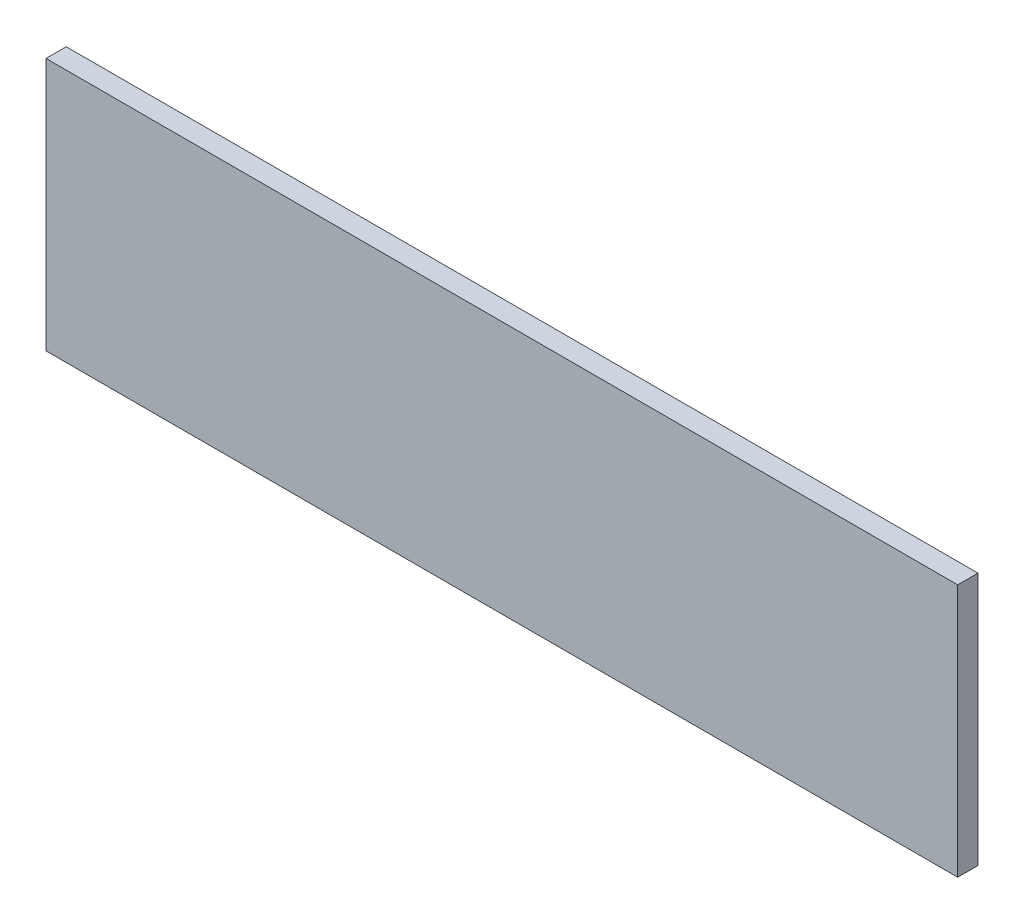
ISO-10303-21;
HEADER;
FILE_DESCRIPTION(('STEP AP214'),'2;1');
FILE_NAME('part.step','',(''),(''),'','','');
FILE_SCHEMA(('AUTOMOTIVE_DESIGN { 1 0 10303 214 1 1 1 1 }'));
ENDSEC;
DATA;
#1=APPLICATION_CONTEXT('core data for automotive mechanical design processes');
#2=APPLICATION_PROTOCOL_DEFINITION('international standard','automotive_design',2000,#1);
#3=PRODUCT_CONTEXT('',#1,'mechanical');
#4=PRODUCT('Part','Part','',(#3));
#5=PRODUCT_RELATED_PRODUCT_CATEGORY('part','',(#4));
#6=PRODUCT_DEFINITION_FORMATION('','',#4);
#7=PRODUCT_DEFINITION_CONTEXT('part definition',#1,'design');
#8=PRODUCT_DEFINITION('design','',#6,#7);
#9=PRODUCT_DEFINITION_SHAPE('','',#8);
#10=(LENGTH_UNIT() NAMED_UNIT(*) SI_UNIT(.MILLI.,.METRE.));
#11=(NAMED_UNIT(*) PLANE_ANGLE_UNIT() SI_UNIT($,.RADIAN.));
#12=(NAMED_UNIT(*) SI_UNIT($,.STERADIAN.) SOLID_ANGLE_UNIT());
#13=UNCERTAINTY_MEASURE_WITH_UNIT(LENGTH_MEASURE(1.E-05),#10,'distance_accuracy_value','');
#14=(GEOMETRIC_REPRESENTATION_CONTEXT(3) GLOBAL_UNCERTAINTY_ASSIGNED_CONTEXT((#13)) GLOBAL_UNIT_ASSIGNED_CONTEXT((#10,
#11,#12)) REPRESENTATION_CONTEXT('',''));
#15=CARTESIAN_POINT('',(0.,0.,0.));
#16=DIRECTION('',(0.,0.,1.));
#17=DIRECTION('',(1.,0.,0.));
#18=AXIS2_PLACEMENT_3D('',#15,#16,#17);
#19=CARTESIAN_POINT('',(-45.,-12.5,2.));
#20=DIRECTION('',(1.,0.,0.));
#21=DIRECTION('',(0.,0.,-1.));
#22=AXIS2_PLACEMENT_3D('',#19,#20,#21);
#23=PLANE('',#22);
#24=DIRECTION('',(0.,-1.,0.));
#25=VECTOR('',#24,1.);
#26=CARTESIAN_POINT('',(-45.,-12.5,0.));
#27=LINE('',#26,#25);
#28=CARTESIAN_POINT('',(-45.,12.5,0.));
#29=VERTEX_POINT('',#28);
#30=CARTESIAN_POINT('',(-45.,-12.5,0.));
#31=VERTEX_POINT('',#30);
#32=EDGE_CURVE('E110',#29,#31,#27,.T.);
#33=ORIENTED_EDGE('',*,*,#32,.T.);
#34=DIRECTION('',(0.,0.,-1.));
#35=VECTOR('',#34,1.);
#36=CARTESIAN_POINT('',(-45.,-12.5,2.));
#37=LINE('',#36,#35);
#38=CARTESIAN_POINT('',(-45.,-12.5,2.));
#39=VERTEX_POINT('',#38);
#40=EDGE_CURVE('E11',#39,#31,#37,.T.);
#41=ORIENTED_EDGE('',*,*,#40,.F.);
#42=DIRECTION('',(0.,-1.,0.));
#43=VECTOR('',#42,1.);
#44=CARTESIAN_POINT('',(-45.,-12.5,2.));
#45=LINE('',#44,#43);
#46=CARTESIAN_POINT('',(-45.,12.5,2.));
#47=VERTEX_POINT('',#46);
#48=EDGE_CURVE('E94',#47,#39,#45,.T.);
#49=ORIENTED_EDGE('',*,*,#48,.F.);
#50=DIRECTION('',(0.,0.,-1.));
#51=VECTOR('',#50,1.);
#52=CARTESIAN_POINT('',(-45.,12.5,2.));
#53=LINE('',#52,#51);
#54=EDGE_CURVE('E106',#47,#29,#53,.T.);
#55=ORIENTED_EDGE('',*,*,#54,.T.);
#56=EDGE_LOOP('',(#33,#41,#49,#55));
#57=FACE_BOUND('',#56,.T.);
#58=ADVANCED_FACE('F42',(#57),#23,.F.);
#59=CARTESIAN_POINT('',(45.,-12.5,2.));
#60=DIRECTION('',(0.,1.,0.));
#61=DIRECTION('',(-1.,0.,0.));
#62=AXIS2_PLACEMENT_3D('',#59,#60,#61);
#63=PLANE('',#62);
#64=DIRECTION('',(1.,0.,0.));
#65=VECTOR('',#64,1.);
#66=CARTESIAN_POINT('',(45.,-12.5,0.));
#67=LINE('',#66,#65);
#68=CARTESIAN_POINT('',(45.,-12.5,0.));
#69=VERTEX_POINT('',#68);
#70=EDGE_CURVE('E99',#31,#69,#67,.T.);
#71=ORIENTED_EDGE('',*,*,#70,.T.);
#72=DIRECTION('',(0.,0.,-1.));
#73=VECTOR('',#72,1.);
#74=CARTESIAN_POINT('',(45.,-12.5,2.));
#75=LINE('',#74,#73);
#76=CARTESIAN_POINT('',(45.,-12.5,2.));
#77=VERTEX_POINT('',#76);
#78=EDGE_CURVE('E51',#77,#69,#75,.T.);
#79=ORIENTED_EDGE('',*,*,#78,.F.);
#80=DIRECTION('',(1.,0.,0.));
#81=VECTOR('',#80,1.);
#82=CARTESIAN_POINT('',(45.,-12.5,2.));
#83=LINE('',#82,#81);
#84=EDGE_CURVE('E89',#39,#77,#83,.T.);
#85=ORIENTED_EDGE('',*,*,#84,.F.);
#86=ORIENTED_EDGE('',*,*,#40,.T.);
#87=EDGE_LOOP('',(#71,#79,#85,#86));
#88=FACE_BOUND('',#87,.T.);
#89=ADVANCED_FACE('F98',(#88),#63,.F.);
#90=CARTESIAN_POINT('',(45.,-12.5,2.));
#91=DIRECTION('',(-1.,0.,0.));
#92=DIRECTION('',(0.,0.,1.));
#93=AXIS2_PLACEMENT_3D('',#90,#91,#92);
#94=PLANE('',#93);
#95=DIRECTION('',(0.,1.,0.));
#96=VECTOR('',#95,1.);
#97=CARTESIAN_POINT('',(45.,-12.5,0.));
#98=LINE('',#97,#96);
#99=CARTESIAN_POINT('',(45.,12.5,0.));
#100=VERTEX_POINT('',#99);
#101=EDGE_CURVE('E76',#69,#100,#98,.T.);
#102=ORIENTED_EDGE('',*,*,#101,.T.);
#103=DIRECTION('',(0.,0.,-1.));
#104=VECTOR('',#103,1.);
#105=CARTESIAN_POINT('',(45.,12.5,2.));
#106=LINE('',#105,#104);
#107=CARTESIAN_POINT('',(45.,12.5,2.));
#108=VERTEX_POINT('',#107);
#109=EDGE_CURVE('E101',#108,#100,#106,.T.);
#110=ORIENTED_EDGE('',*,*,#109,.F.);
#111=DIRECTION('',(0.,1.,0.));
#112=VECTOR('',#111,1.);
#113=CARTESIAN_POINT('',(45.,-12.5,2.));
#114=LINE('',#113,#112);
#115=EDGE_CURVE('E92',#77,#108,#114,.T.);
#116=ORIENTED_EDGE('',*,*,#115,.F.);
#117=ORIENTED_EDGE('',*,*,#78,.T.);
#118=EDGE_LOOP('',(#102,#110,#116,#117));
#119=FACE_BOUND('',#118,.T.);
#120=ADVANCED_FACE('F102',(#119),#94,.F.);
#121=CARTESIAN_POINT('',(45.,12.5,2.));
#122=DIRECTION('',(0.,-1.,0.));
#123=DIRECTION('',(1.,0.,0.));
#124=AXIS2_PLACEMENT_3D('',#121,#122,#123);
#125=PLANE('',#124);
#126=DIRECTION('',(-1.,0.,0.));
#127=VECTOR('',#126,1.);
#128=CARTESIAN_POINT('',(45.,12.5,0.));
#129=LINE('',#128,#127);
#130=EDGE_CURVE('E82',#100,#29,#129,.T.);
#131=ORIENTED_EDGE('',*,*,#130,.T.);
#132=ORIENTED_EDGE('',*,*,#54,.F.);
#133=DIRECTION('',(-1.,0.,0.));
#134=VECTOR('',#133,1.);
#135=CARTESIAN_POINT('',(45.,12.5,2.));
#136=LINE('',#135,#134);
#137=EDGE_CURVE('E59',#108,#47,#136,.T.);
#138=ORIENTED_EDGE('',*,*,#137,.F.);
#139=ORIENTED_EDGE('',*,*,#109,.T.);
#140=EDGE_LOOP('',(#131,#132,#138,#139));
#141=FACE_BOUND('',#140,.T.);
#142=ADVANCED_FACE('F123',(#141),#125,.F.);
#143=CARTESIAN_POINT('',(0.,0.,2.));
#144=DIRECTION('',(0.,0.,1.));
#145=DIRECTION('',(1.,0.,0.));
#146=AXIS2_PLACEMENT_3D('',#143,#144,#145);
#147=PLANE('',#146);
#148=ORIENTED_EDGE('',*,*,#48,.T.);
#149=ORIENTED_EDGE('',*,*,#84,.T.);
#150=ORIENTED_EDGE('',*,*,#115,.T.);
#151=ORIENTED_EDGE('',*,*,#137,.T.);
#152=EDGE_LOOP('',(#148,#149,#150,#151));
#153=FACE_BOUND('',#152,.T.);
#154=ADVANCED_FACE('F90',(#153),#147,.T.);
#155=CARTESIAN_POINT('',(0.,0.,0.));
#156=DIRECTION('',(0.,0.,1.));
#157=DIRECTION('',(1.,0.,0.));
#158=AXIS2_PLACEMENT_3D('',#155,#156,#157);
#159=PLANE('',#158);
#160=ORIENTED_EDGE('',*,*,#32,.F.);
#161=ORIENTED_EDGE('',*,*,#130,.F.);
#162=ORIENTED_EDGE('',*,*,#101,.F.);
#163=ORIENTED_EDGE('',*,*,#70,.F.);
#164=EDGE_LOOP('',(#160,#161,#162,#163));
#165=FACE_BOUND('',#164,.T.);
#166=ADVANCED_FACE('F126',(#165),#159,.F.);
#167=CLOSED_SHELL('',(#58,#89,#120,#142,#154,#166));
#168=MANIFOLD_SOLID_BREP('B2',#167);
#169=ADVANCED_BREP_SHAPE_REPRESENTATION('',(#18,#168),#14);
#170=SHAPE_DEFINITION_REPRESENTATION(#9,#169);
ENDSEC;
END-ISO-10303-21;
